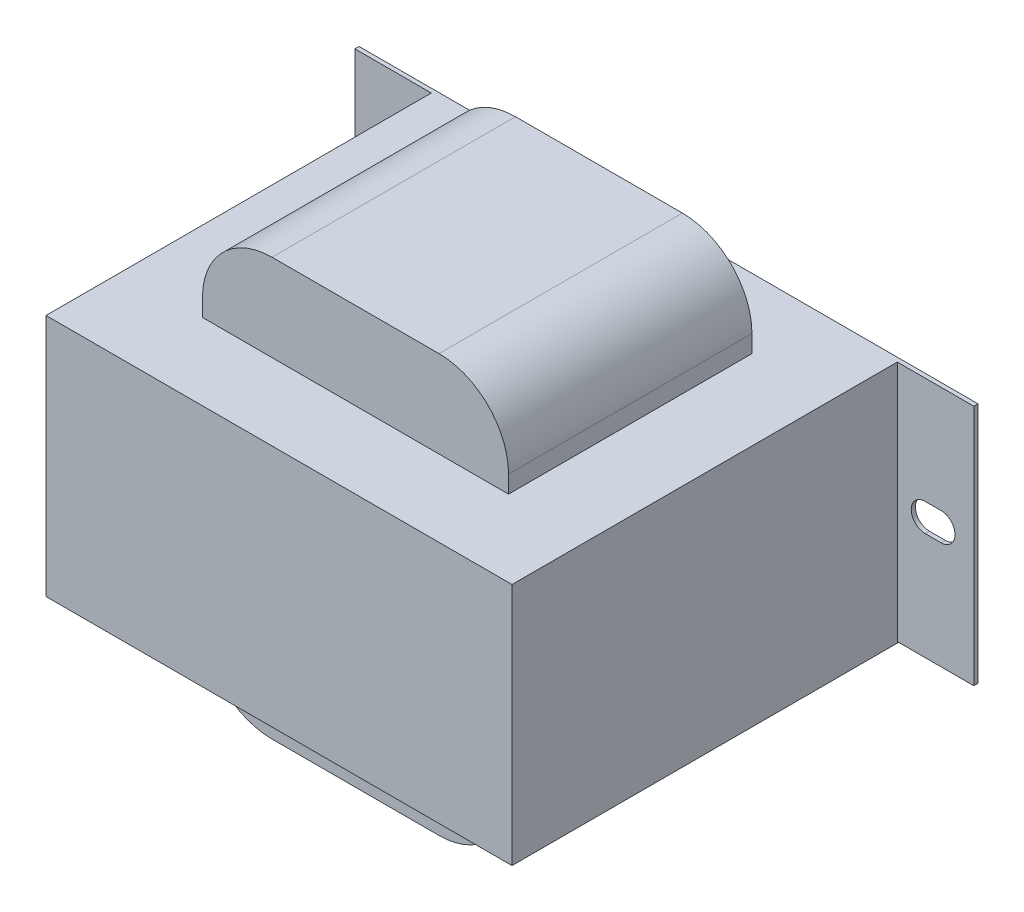
ISO-10303-21;
HEADER;
FILE_DESCRIPTION(('STEP AP214'),'2;1');
FILE_NAME('part.step','',(''),(''),'','','');
FILE_SCHEMA(('AUTOMOTIVE_DESIGN { 1 0 10303 214 1 1 1 1 }'));
ENDSEC;
DATA;
#1=APPLICATION_CONTEXT('core data for automotive mechanical design processes');
#2=APPLICATION_PROTOCOL_DEFINITION('international standard','automotive_design',2000,#1);
#3=PRODUCT_CONTEXT('',#1,'mechanical');
#4=PRODUCT('Part','Part','',(#3));
#5=PRODUCT_RELATED_PRODUCT_CATEGORY('part','',(#4));
#6=PRODUCT_DEFINITION_FORMATION('','',#4);
#7=PRODUCT_DEFINITION_CONTEXT('part definition',#1,'design');
#8=PRODUCT_DEFINITION('design','',#6,#7);
#9=PRODUCT_DEFINITION_SHAPE('','',#8);
#10=(LENGTH_UNIT() NAMED_UNIT(*) SI_UNIT(.MILLI.,.METRE.));
#11=(NAMED_UNIT(*) PLANE_ANGLE_UNIT() SI_UNIT($,.RADIAN.));
#12=(NAMED_UNIT(*) SI_UNIT($,.STERADIAN.) SOLID_ANGLE_UNIT());
#13=UNCERTAINTY_MEASURE_WITH_UNIT(LENGTH_MEASURE(1.E-05),#10,'distance_accuracy_value','');
#14=(GEOMETRIC_REPRESENTATION_CONTEXT(3) GLOBAL_UNCERTAINTY_ASSIGNED_CONTEXT((#13)) GLOBAL_UNIT_ASSIGNED_CONTEXT((#10,
#11,#12)) REPRESENTATION_CONTEXT('',''));
#15=CARTESIAN_POINT('',(0.,0.,0.));
#16=DIRECTION('',(0.,0.,1.));
#17=DIRECTION('',(1.,0.,0.));
#18=AXIS2_PLACEMENT_3D('',#15,#16,#17);
#19=CARTESIAN_POINT('',(33.5,17.5,56.));
#20=DIRECTION('',(-1.,0.,0.));
#21=DIRECTION('',(0.,0.,1.));
#22=AXIS2_PLACEMENT_3D('',#19,#20,#21);
#23=PLANE('',#22);
#24=DIRECTION('',(0.,0.,-1.));
#25=VECTOR('',#24,1.);
#26=CARTESIAN_POINT('',(33.5,-17.3083227098887,0.6));
#27=LINE('',#26,#25);
#28=CARTESIAN_POINT('',(33.5,-17.3083227098887,0.6));
#29=VERTEX_POINT('',#28);
#30=CARTESIAN_POINT('',(33.5,-17.3083227098887,0.));
#31=VERTEX_POINT('',#30);
#32=EDGE_CURVE('E356',#29,#31,#27,.T.);
#33=ORIENTED_EDGE('',*,*,#32,.F.);
#34=DIRECTION('',(0.,1.,0.));
#35=VECTOR('',#34,1.);
#36=CARTESIAN_POINT('',(33.5,17.5,0.6));
#37=LINE('',#36,#35);
#38=CARTESIAN_POINT('',(33.5,17.5,0.600000000000003));
#39=VERTEX_POINT('',#38);
#40=EDGE_CURVE('E337',#29,#39,#37,.T.);
#41=ORIENTED_EDGE('',*,*,#40,.T.);
#42=DIRECTION('',(0.,0.,-1.));
#43=VECTOR('',#42,1.);
#44=CARTESIAN_POINT('',(33.5,17.5,56.));
#45=LINE('',#44,#43);
#46=CARTESIAN_POINT('',(33.5,17.5,56.));
#47=VERTEX_POINT('',#46);
#48=EDGE_CURVE('E314',#47,#39,#45,.T.);
#49=ORIENTED_EDGE('',*,*,#48,.F.);
#50=DIRECTION('',(0.,1.,0.));
#51=VECTOR('',#50,1.);
#52=CARTESIAN_POINT('',(33.5,17.5,56.));
#53=LINE('',#52,#51);
#54=CARTESIAN_POINT('',(33.5,-17.5,56.));
#55=VERTEX_POINT('',#54);
#56=EDGE_CURVE('E320',#55,#47,#53,.T.);
#57=ORIENTED_EDGE('',*,*,#56,.F.);
#58=DIRECTION('',(0.,0.,-1.));
#59=VECTOR('',#58,1.);
#60=CARTESIAN_POINT('',(33.5,-17.5,56.));
#61=LINE('',#60,#59);
#62=CARTESIAN_POINT('',(33.5,-17.5,0.));
#63=VERTEX_POINT('',#62);
#64=EDGE_CURVE('E318',#55,#63,#61,.T.);
#65=ORIENTED_EDGE('',*,*,#64,.T.);
#66=DIRECTION('',(0.,1.,0.));
#67=VECTOR('',#66,1.);
#68=CARTESIAN_POINT('',(33.5,17.5,0.));
#69=LINE('',#68,#67);
#70=EDGE_CURVE('E335',#63,#31,#69,.T.);
#71=ORIENTED_EDGE('',*,*,#70,.T.);
#72=EDGE_LOOP('',(#33,#41,#49,#57,#65,#71));
#73=FACE_BOUND('',#72,.T.);
#74=ADVANCED_FACE('F28',(#73),#23,.F.);
#75=CARTESIAN_POINT('',(-33.5,-17.5,56.));
#76=DIRECTION('',(0.,1.,0.));
#77=DIRECTION('',(-1.,0.,0.));
#78=AXIS2_PLACEMENT_3D('',#75,#76,#77);
#79=PLANE('',#78);
#80=DIRECTION('',(1.,0.,0.));
#81=VECTOR('',#80,1.);
#82=CARTESIAN_POINT('',(-33.5,-17.5,0.));
#83=LINE('',#82,#81);
#84=CARTESIAN_POINT('',(-33.5,-17.5,0.));
#85=VERTEX_POINT('',#84);
#86=EDGE_CURVE('E439',#85,#63,#83,.T.);
#87=ORIENTED_EDGE('',*,*,#86,.T.);
#88=ORIENTED_EDGE('',*,*,#64,.F.);
#89=DIRECTION('',(1.,0.,0.));
#90=VECTOR('',#89,1.);
#91=CARTESIAN_POINT('',(-33.5,-17.5,56.));
#92=LINE('',#91,#90);
#93=CARTESIAN_POINT('',(-33.5,-17.5,56.));
#94=VERTEX_POINT('',#93);
#95=EDGE_CURVE('E445',#94,#55,#92,.T.);
#96=ORIENTED_EDGE('',*,*,#95,.F.);
#97=DIRECTION('',(0.,0.,-1.));
#98=VECTOR('',#97,1.);
#99=CARTESIAN_POINT('',(-33.5,-17.5,56.));
#100=LINE('',#99,#98);
#101=EDGE_CURVE('E523',#94,#85,#100,.T.);
#102=ORIENTED_EDGE('',*,*,#101,.T.);
#103=EDGE_LOOP('',(#87,#88,#96,#102));
#104=FACE_BOUND('',#103,.T.);
#105=DIRECTION('',(1.,0.,0.));
#106=VECTOR('',#105,1.);
#107=CARTESIAN_POINT('',(-33.5,-17.5,9.99999999999999));
#108=LINE('',#107,#106);
#109=CARTESIAN_POINT('',(-22.,-17.5,9.99999999999999));
#110=VERTEX_POINT('',#109);
#111=CARTESIAN_POINT('',(22.,-17.5,9.99999999999999));
#112=VERTEX_POINT('',#111);
#113=EDGE_CURVE('E430',#110,#112,#108,.T.);
#114=ORIENTED_EDGE('',*,*,#113,.F.);
#115=DIRECTION('',(0.,0.,1.));
#116=VECTOR('',#115,1.);
#117=CARTESIAN_POINT('',(-22.,-17.5,56.));
#118=LINE('',#117,#116);
#119=CARTESIAN_POINT('',(-22.,-17.5,45.));
#120=VERTEX_POINT('',#119);
#121=EDGE_CURVE('E432',#110,#120,#118,.T.);
#122=ORIENTED_EDGE('',*,*,#121,.T.);
#123=DIRECTION('',(1.,0.,0.));
#124=VECTOR('',#123,1.);
#125=CARTESIAN_POINT('',(-33.5,-17.5,45.));
#126=LINE('',#125,#124);
#127=CARTESIAN_POINT('',(22.,-17.5,45.));
#128=VERTEX_POINT('',#127);
#129=EDGE_CURVE('E412',#120,#128,#126,.T.);
#130=ORIENTED_EDGE('',*,*,#129,.T.);
#131=DIRECTION('',(0.,0.,-1.));
#132=VECTOR('',#131,1.);
#133=CARTESIAN_POINT('',(22.,-17.5,56.));
#134=LINE('',#133,#132);
#135=EDGE_CURVE('E435',#128,#112,#134,.T.);
#136=ORIENTED_EDGE('',*,*,#135,.T.);
#137=EDGE_LOOP('',(#114,#122,#130,#136));
#138=FACE_BOUND('',#137,.T.);
#139=ADVANCED_FACE('F524',(#104,#138),#79,.F.);
#140=CARTESIAN_POINT('',(-33.5,17.5,56.));
#141=DIRECTION('',(0.,-1.,0.));
#142=DIRECTION('',(0.,0.,-1.));
#143=AXIS2_PLACEMENT_3D('',#140,#141,#142);
#144=PLANE('',#143);
#145=DIRECTION('',(-1.,0.,0.));
#146=VECTOR('',#145,1.);
#147=CARTESIAN_POINT('',(-33.5,17.5,0.));
#148=LINE('',#147,#146);
#149=CARTESIAN_POINT('',(44.5,17.5,0.));
#150=VERTEX_POINT('',#149);
#151=CARTESIAN_POINT('',(-44.5,17.5,0.));
#152=VERTEX_POINT('',#151);
#153=EDGE_CURVE('E442',#150,#152,#148,.T.);
#154=ORIENTED_EDGE('',*,*,#153,.T.);
#155=DIRECTION('',(0.,0.,-1.));
#156=VECTOR('',#155,1.);
#157=CARTESIAN_POINT('',(-44.5,17.5,0.6));
#158=LINE('',#157,#156);
#159=CARTESIAN_POINT('',(-44.5,17.5,0.6));
#160=VERTEX_POINT('',#159);
#161=EDGE_CURVE('E280',#160,#152,#158,.T.);
#162=ORIENTED_EDGE('',*,*,#161,.F.);
#163=DIRECTION('',(1.,0.,0.));
#164=VECTOR('',#163,1.);
#165=CARTESIAN_POINT('',(-33.5,17.5,0.6));
#166=LINE('',#165,#164);
#167=CARTESIAN_POINT('',(-33.5,17.5,0.6));
#168=VERTEX_POINT('',#167);
#169=EDGE_CURVE('E279',#160,#168,#166,.T.);
#170=ORIENTED_EDGE('',*,*,#169,.T.);
#171=DIRECTION('',(0.,0.,-1.));
#172=VECTOR('',#171,1.);
#173=CARTESIAN_POINT('',(-33.5,17.5,56.));
#174=LINE('',#173,#172);
#175=CARTESIAN_POINT('',(-33.5,17.5,56.));
#176=VERTEX_POINT('',#175);
#177=EDGE_CURVE('E306',#176,#168,#174,.T.);
#178=ORIENTED_EDGE('',*,*,#177,.F.);
#179=DIRECTION('',(-1.,0.,0.));
#180=VECTOR('',#179,1.);
#181=CARTESIAN_POINT('',(-33.5,17.5,56.));
#182=LINE('',#181,#180);
#183=EDGE_CURVE('E315',#47,#176,#182,.T.);
#184=ORIENTED_EDGE('',*,*,#183,.F.);
#185=ORIENTED_EDGE('',*,*,#48,.T.);
#186=DIRECTION('',(1.,0.,0.));
#187=VECTOR('',#186,1.);
#188=CARTESIAN_POINT('',(33.5,17.5,0.6));
#189=LINE('',#188,#187);
#190=CARTESIAN_POINT('',(44.5,17.5,0.6));
#191=VERTEX_POINT('',#190);
#192=EDGE_CURVE('E53',#39,#191,#189,.T.);
#193=ORIENTED_EDGE('',*,*,#192,.T.);
#194=DIRECTION('',(0.,0.,-1.));
#195=VECTOR('',#194,1.);
#196=CARTESIAN_POINT('',(44.5,17.5,0.6));
#197=LINE('',#196,#195);
#198=EDGE_CURVE('E353',#191,#150,#197,.T.);
#199=ORIENTED_EDGE('',*,*,#198,.T.);
#200=EDGE_LOOP('',(#154,#162,#170,#178,#184,#185,#193,#199));
#201=FACE_BOUND('',#200,.T.);
#202=DIRECTION('',(-1.,0.,0.));
#203=VECTOR('',#202,1.);
#204=CARTESIAN_POINT('',(-33.5,17.5,9.99999999999999));
#205=LINE('',#204,#203);
#206=CARTESIAN_POINT('',(22.,17.5,9.99999999999999));
#207=VERTEX_POINT('',#206);
#208=CARTESIAN_POINT('',(-22.,17.5,9.99999999999999));
#209=VERTEX_POINT('',#208);
#210=EDGE_CURVE('E11',#207,#209,#205,.T.);
#211=ORIENTED_EDGE('',*,*,#210,.F.);
#212=DIRECTION('',(0.,0.,1.));
#213=VECTOR('',#212,1.);
#214=CARTESIAN_POINT('',(22.,17.5,56.));
#215=LINE('',#214,#213);
#216=CARTESIAN_POINT('',(22.,17.5,45.));
#217=VERTEX_POINT('',#216);
#218=EDGE_CURVE('E37',#207,#217,#215,.T.);
#219=ORIENTED_EDGE('',*,*,#218,.T.);
#220=DIRECTION('',(-1.,0.,0.));
#221=VECTOR('',#220,1.);
#222=CARTESIAN_POINT('',(-33.5,17.5,45.));
#223=LINE('',#222,#221);
#224=CARTESIAN_POINT('',(-22.,17.5,45.));
#225=VERTEX_POINT('',#224);
#226=EDGE_CURVE('E526',#217,#225,#223,.T.);
#227=ORIENTED_EDGE('',*,*,#226,.T.);
#228=DIRECTION('',(0.,0.,-1.));
#229=VECTOR('',#228,1.);
#230=CARTESIAN_POINT('',(-22.,17.5,56.));
#231=LINE('',#230,#229);
#232=EDGE_CURVE('E528',#225,#209,#231,.T.);
#233=ORIENTED_EDGE('',*,*,#232,.T.);
#234=EDGE_LOOP('',(#211,#219,#227,#233));
#235=FACE_BOUND('',#234,.T.);
#236=ADVANCED_FACE('F303',(#201,#235),#144,.F.);
#237=CARTESIAN_POINT('',(-33.5,17.5,56.));
#238=DIRECTION('',(1.,0.,0.));
#239=DIRECTION('',(0.,1.,0.));
#240=AXIS2_PLACEMENT_3D('',#237,#238,#239);
#241=PLANE('',#240);
#242=ORIENTED_EDGE('',*,*,#177,.T.);
#243=DIRECTION('',(0.,-1.,0.));
#244=VECTOR('',#243,1.);
#245=CARTESIAN_POINT('',(-33.5,17.5,0.6));
#246=LINE('',#245,#244);
#247=CARTESIAN_POINT('',(-33.5,-17.3083227098887,0.6));
#248=VERTEX_POINT('',#247);
#249=EDGE_CURVE('E272',#168,#248,#246,.T.);
#250=ORIENTED_EDGE('',*,*,#249,.T.);
#251=DIRECTION('',(0.,0.,-1.));
#252=VECTOR('',#251,1.);
#253=CARTESIAN_POINT('',(-33.5,-17.3083227098887,0.6));
#254=LINE('',#253,#252);
#255=CARTESIAN_POINT('',(-33.5,-17.3083227098887,0.));
#256=VERTEX_POINT('',#255);
#257=EDGE_CURVE('E286',#248,#256,#254,.T.);
#258=ORIENTED_EDGE('',*,*,#257,.T.);
#259=DIRECTION('',(0.,-1.,0.));
#260=VECTOR('',#259,1.);
#261=CARTESIAN_POINT('',(-33.5,17.5,0.));
#262=LINE('',#261,#260);
#263=EDGE_CURVE('E324',#256,#85,#262,.T.);
#264=ORIENTED_EDGE('',*,*,#263,.T.);
#265=ORIENTED_EDGE('',*,*,#101,.F.);
#266=DIRECTION('',(0.,-1.,0.));
#267=VECTOR('',#266,1.);
#268=CARTESIAN_POINT('',(-33.5,17.5,56.));
#269=LINE('',#268,#267);
#270=EDGE_CURVE('E313',#176,#94,#269,.T.);
#271=ORIENTED_EDGE('',*,*,#270,.F.);
#272=EDGE_LOOP('',(#242,#250,#258,#264,#265,#271));
#273=FACE_BOUND('',#272,.T.);
#274=ADVANCED_FACE('F30',(#273),#241,.F.);
#275=CARTESIAN_POINT('',(-33.5,-17.5,56.));
#276=DIRECTION('',(0.,0.,1.));
#277=DIRECTION('',(1.,0.,0.));
#278=AXIS2_PLACEMENT_3D('',#275,#276,#277);
#279=PLANE('',#278);
#280=ORIENTED_EDGE('',*,*,#270,.T.);
#281=ORIENTED_EDGE('',*,*,#95,.T.);
#282=ORIENTED_EDGE('',*,*,#56,.T.);
#283=ORIENTED_EDGE('',*,*,#183,.T.);
#284=EDGE_LOOP('',(#280,#281,#282,#283));
#285=FACE_BOUND('',#284,.T.);
#286=ADVANCED_FACE('F449',(#285),#279,.T.);
#287=CARTESIAN_POINT('',(-33.5,-17.5,0.));
#288=DIRECTION('',(0.,0.,1.));
#289=DIRECTION('',(1.,0.,0.));
#290=AXIS2_PLACEMENT_3D('',#287,#288,#289);
#291=PLANE('',#290);
#292=ORIENTED_EDGE('',*,*,#263,.F.);
#293=DIRECTION('',(-1.,0.,0.));
#294=VECTOR('',#293,1.);
#295=CARTESIAN_POINT('',(-33.5,-17.3083227098887,0.));
#296=LINE('',#295,#294);
#297=CARTESIAN_POINT('',(-44.5,-17.3083227098887,0.));
#298=VERTEX_POINT('',#297);
#299=EDGE_CURVE('E45',#256,#298,#296,.T.);
#300=ORIENTED_EDGE('',*,*,#299,.T.);
#301=DIRECTION('',(0.,1.,0.));
#302=VECTOR('',#301,1.);
#303=CARTESIAN_POINT('',(-44.5,17.5,0.));
#304=LINE('',#303,#302);
#305=EDGE_CURVE('E269',#298,#152,#304,.T.);
#306=ORIENTED_EDGE('',*,*,#305,.T.);
#307=ORIENTED_EDGE('',*,*,#153,.F.);
#308=DIRECTION('',(0.,-1.,0.));
#309=VECTOR('',#308,1.);
#310=CARTESIAN_POINT('',(44.5,17.5,0.));
#311=LINE('',#310,#309);
#312=CARTESIAN_POINT('',(44.5,-17.3083227098887,0.));
#313=VERTEX_POINT('',#312);
#314=EDGE_CURVE('E345',#150,#313,#311,.T.);
#315=ORIENTED_EDGE('',*,*,#314,.T.);
#316=DIRECTION('',(-1.,0.,0.));
#317=VECTOR('',#316,1.);
#318=CARTESIAN_POINT('',(33.5,-17.3083227098887,0.));
#319=LINE('',#318,#317);
#320=EDGE_CURVE('E340',#313,#31,#319,.T.);
#321=ORIENTED_EDGE('',*,*,#320,.T.);
#322=ORIENTED_EDGE('',*,*,#70,.F.);
#323=ORIENTED_EDGE('',*,*,#86,.F.);
#324=EDGE_LOOP('',(#292,#300,#306,#307,#315,#321,#322,#323));
#325=FACE_BOUND('',#324,.T.);
#326=DIRECTION('',(-1.,0.,0.));
#327=VECTOR('',#326,1.);
#328=CARTESIAN_POINT('',(37.5,-1.85275400788431,0.));
#329=LINE('',#328,#327);
#330=CARTESIAN_POINT('',(39.8,-1.85275400788431,0.));
#331=VERTEX_POINT('',#330);
#332=CARTESIAN_POINT('',(37.5,-1.85275400788431,0.));
#333=VERTEX_POINT('',#332);
#334=EDGE_CURVE('E496',#331,#333,#329,.T.);
#335=ORIENTED_EDGE('',*,*,#334,.F.);
#336=CARTESIAN_POINT('',(39.8,0.147245992115691,0.));
#337=DIRECTION('',(0.,0.,-1.));
#338=DIRECTION('',(-1.,0.,0.));
#339=AXIS2_PLACEMENT_3D('',#336,#337,#338);
#340=CIRCLE('',#339,2.);
#341=CARTESIAN_POINT('',(39.8,2.14724599211569,0.));
#342=VERTEX_POINT('',#341);
#343=EDGE_CURVE('E283',#342,#331,#340,.T.);
#344=ORIENTED_EDGE('',*,*,#343,.F.);
#345=DIRECTION('',(1.,0.,0.));
#346=VECTOR('',#345,1.);
#347=CARTESIAN_POINT('',(39.8,2.14724599211569,0.));
#348=LINE('',#347,#346);
#349=CARTESIAN_POINT('',(37.5,2.14724599211569,0.));
#350=VERTEX_POINT('',#349);
#351=EDGE_CURVE('E492',#350,#342,#348,.T.);
#352=ORIENTED_EDGE('',*,*,#351,.F.);
#353=CARTESIAN_POINT('',(37.5,0.147245992115691,0.));
#354=DIRECTION('',(0.,0.,-1.));
#355=DIRECTION('',(-1.,0.,0.));
#356=AXIS2_PLACEMENT_3D('',#353,#354,#355);
#357=CIRCLE('',#356,2.);
#358=EDGE_CURVE('E494',#333,#350,#357,.T.);
#359=ORIENTED_EDGE('',*,*,#358,.F.);
#360=EDGE_LOOP('',(#335,#344,#352,#359));
#361=FACE_BOUND('',#360,.T.);
#362=CARTESIAN_POINT('',(-37.5,0.147245992115691,0.));
#363=DIRECTION('',(0.,0.,-1.));
#364=DIRECTION('',(1.,0.,0.));
#365=AXIS2_PLACEMENT_3D('',#362,#363,#364);
#366=CIRCLE('',#365,2.);
#367=CARTESIAN_POINT('',(-37.5,2.14724599211569,0.));
#368=VERTEX_POINT('',#367);
#369=CARTESIAN_POINT('',(-37.5,-1.85275400788431,0.));
#370=VERTEX_POINT('',#369);
#371=EDGE_CURVE('E247',#368,#370,#366,.T.);
#372=ORIENTED_EDGE('',*,*,#371,.F.);
#373=DIRECTION('',(1.,0.,0.));
#374=VECTOR('',#373,1.);
#375=CARTESIAN_POINT('',(-39.8,2.14724599211569,0.));
#376=LINE('',#375,#374);
#377=CARTESIAN_POINT('',(-39.8,2.14724599211569,0.));
#378=VERTEX_POINT('',#377);
#379=EDGE_CURVE('E251',#378,#368,#376,.T.);
#380=ORIENTED_EDGE('',*,*,#379,.F.);
#381=CARTESIAN_POINT('',(-39.8,0.147245992115691,0.));
#382=DIRECTION('',(0.,0.,-1.));
#383=DIRECTION('',(1.,0.,0.));
#384=AXIS2_PLACEMENT_3D('',#381,#382,#383);
#385=CIRCLE('',#384,2.);
#386=CARTESIAN_POINT('',(-39.8,-1.85275400788431,0.));
#387=VERTEX_POINT('',#386);
#388=EDGE_CURVE('E231',#387,#378,#385,.T.);
#389=ORIENTED_EDGE('',*,*,#388,.F.);
#390=DIRECTION('',(-1.,0.,0.));
#391=VECTOR('',#390,1.);
#392=CARTESIAN_POINT('',(-37.5,-1.85275400788431,0.));
#393=LINE('',#392,#391);
#394=EDGE_CURVE('E243',#370,#387,#393,.T.);
#395=ORIENTED_EDGE('',*,*,#394,.F.);
#396=EDGE_LOOP('',(#372,#380,#389,#395));
#397=FACE_BOUND('',#396,.T.);
#398=ADVANCED_FACE('F249',(#325,#361,#397),#291,.F.);
#399=CARTESIAN_POINT('',(-12.,20.,9.99999999999999));
#400=DIRECTION('',(0.,0.,1.));
#401=DIRECTION('',(1.,0.,0.));
#402=AXIS2_PLACEMENT_3D('',#399,#400,#401);
#403=CYLINDRICAL_SURFACE('',#402,9.99999999999999);
#404=CARTESIAN_POINT('',(-12.,20.,45.));
#405=DIRECTION('',(0.,0.,1.));
#406=DIRECTION('',(1.,0.,0.));
#407=AXIS2_PLACEMENT_3D('',#404,#405,#406);
#408=CIRCLE('',#407,9.99999999999999);
#409=CARTESIAN_POINT('',(-12.,30.,45.));
#410=VERTEX_POINT('',#409);
#411=CARTESIAN_POINT('',(-22.,20.,45.));
#412=VERTEX_POINT('',#411);
#413=EDGE_CURVE('E359',#410,#412,#408,.T.);
#414=ORIENTED_EDGE('',*,*,#413,.F.);
#415=DIRECTION('',(0.,0.,1.));
#416=VECTOR('',#415,1.);
#417=CARTESIAN_POINT('',(-12.,30.,9.99999999999999));
#418=LINE('',#417,#416);
#419=CARTESIAN_POINT('',(-12.,30.,9.99999999999999));
#420=VERTEX_POINT('',#419);
#421=EDGE_CURVE('E410',#420,#410,#418,.T.);
#422=ORIENTED_EDGE('',*,*,#421,.F.);
#423=CARTESIAN_POINT('',(-12.,20.,9.99999999999999));
#424=DIRECTION('',(0.,0.,1.));
#425=DIRECTION('',(1.,0.,0.));
#426=AXIS2_PLACEMENT_3D('',#423,#424,#425);
#427=CIRCLE('',#426,9.99999999999999);
#428=CARTESIAN_POINT('',(-22.,20.,9.99999999999999));
#429=VERTEX_POINT('',#428);
#430=EDGE_CURVE('E383',#420,#429,#427,.T.);
#431=ORIENTED_EDGE('',*,*,#430,.T.);
#432=DIRECTION('',(0.,0.,1.));
#433=VECTOR('',#432,1.);
#434=CARTESIAN_POINT('',(-22.,20.,9.99999999999999));
#435=LINE('',#434,#433);
#436=EDGE_CURVE('E409',#429,#412,#435,.T.);
#437=ORIENTED_EDGE('',*,*,#436,.T.);
#438=EDGE_LOOP('',(#414,#422,#431,#437));
#439=FACE_BOUND('',#438,.T.);
#440=ADVANCED_FACE('F556',(#439),#403,.T.);
#441=CARTESIAN_POINT('',(-12.,30.,9.99999999999999));
#442=DIRECTION('',(0.,1.,0.));
#443=DIRECTION('',(0.,0.,1.));
#444=AXIS2_PLACEMENT_3D('',#441,#442,#443);
#445=PLANE('',#444);
#446=DIRECTION('',(-1.,0.,0.));
#447=VECTOR('',#446,1.);
#448=CARTESIAN_POINT('',(-12.,30.,45.));
#449=LINE('',#448,#447);
#450=CARTESIAN_POINT('',(12.,30.,45.));
#451=VERTEX_POINT('',#450);
#452=EDGE_CURVE('E380',#451,#410,#449,.T.);
#453=ORIENTED_EDGE('',*,*,#452,.F.);
#454=DIRECTION('',(0.,0.,1.));
#455=VECTOR('',#454,1.);
#456=CARTESIAN_POINT('',(12.,30.,9.99999999999999));
#457=LINE('',#456,#455);
#458=CARTESIAN_POINT('',(12.,30.,9.99999999999999));
#459=VERTEX_POINT('',#458);
#460=EDGE_CURVE('E413',#459,#451,#457,.T.);
#461=ORIENTED_EDGE('',*,*,#460,.F.);
#462=DIRECTION('',(-1.,0.,0.));
#463=VECTOR('',#462,1.);
#464=CARTESIAN_POINT('',(-12.,30.,9.99999999999999));
#465=LINE('',#464,#463);
#466=EDGE_CURVE('E406',#459,#420,#465,.T.);
#467=ORIENTED_EDGE('',*,*,#466,.T.);
#468=ORIENTED_EDGE('',*,*,#421,.T.);
#469=EDGE_LOOP('',(#453,#461,#467,#468));
#470=FACE_BOUND('',#469,.T.);
#471=ADVANCED_FACE('F553',(#470),#445,.T.);
#472=CARTESIAN_POINT('',(12.,20.,9.99999999999999));
#473=DIRECTION('',(0.,0.,1.));
#474=DIRECTION('',(1.,0.,0.));
#475=AXIS2_PLACEMENT_3D('',#472,#473,#474);
#476=CYLINDRICAL_SURFACE('',#475,9.99999999999999);
#477=CARTESIAN_POINT('',(12.,20.,45.));
#478=DIRECTION('',(0.,0.,1.));
#479=DIRECTION('',(-1.,0.,0.));
#480=AXIS2_PLACEMENT_3D('',#477,#478,#479);
#481=CIRCLE('',#480,9.99999999999999);
#482=CARTESIAN_POINT('',(22.,20.,45.));
#483=VERTEX_POINT('',#482);
#484=EDGE_CURVE('E377',#483,#451,#481,.T.);
#485=ORIENTED_EDGE('',*,*,#484,.F.);
#486=DIRECTION('',(0.,0.,1.));
#487=VECTOR('',#486,1.);
#488=CARTESIAN_POINT('',(22.,20.,9.99999999999999));
#489=LINE('',#488,#487);
#490=CARTESIAN_POINT('',(22.,20.,9.99999999999999));
#491=VERTEX_POINT('',#490);
#492=EDGE_CURVE('E415',#491,#483,#489,.T.);
#493=ORIENTED_EDGE('',*,*,#492,.F.);
#494=CARTESIAN_POINT('',(12.,20.,9.99999999999999));
#495=DIRECTION('',(0.,0.,1.));
#496=DIRECTION('',(-1.,0.,0.));
#497=AXIS2_PLACEMENT_3D('',#494,#495,#496);
#498=CIRCLE('',#497,9.99999999999999);
#499=EDGE_CURVE('E403',#491,#459,#498,.T.);
#500=ORIENTED_EDGE('',*,*,#499,.T.);
#501=ORIENTED_EDGE('',*,*,#460,.T.);
#502=EDGE_LOOP('',(#485,#493,#500,#501));
#503=FACE_BOUND('',#502,.T.);
#504=ADVANCED_FACE('F548',(#503),#476,.T.);
#505=CARTESIAN_POINT('',(-12.,20.,9.99999999999999));
#506=DIRECTION('',(0.,0.,1.));
#507=DIRECTION('',(1.,0.,0.));
#508=AXIS2_PLACEMENT_3D('',#505,#506,#507);
#509=PLANE('',#508);
#510=DIRECTION('',(0.,1.,0.));
#511=VECTOR('',#510,1.);
#512=CARTESIAN_POINT('',(22.,20.,9.99999999999999));
#513=LINE('',#512,#511);
#514=EDGE_CURVE('E399',#207,#491,#513,.T.);
#515=ORIENTED_EDGE('',*,*,#514,.F.);
#516=ORIENTED_EDGE('',*,*,#210,.T.);
#517=DIRECTION('',(0.,-1.,0.));
#518=VECTOR('',#517,1.);
#519=CARTESIAN_POINT('',(-22.,20.,9.99999999999999));
#520=LINE('',#519,#518);
#521=EDGE_CURVE('E387',#429,#209,#520,.T.);
#522=ORIENTED_EDGE('',*,*,#521,.F.);
#523=ORIENTED_EDGE('',*,*,#430,.F.);
#524=ORIENTED_EDGE('',*,*,#466,.F.);
#525=ORIENTED_EDGE('',*,*,#499,.F.);
#526=EDGE_LOOP('',(#515,#516,#522,#523,#524,#525));
#527=FACE_BOUND('',#526,.T.);
#528=ADVANCED_FACE('F542',(#527),#509,.F.);
#529=CARTESIAN_POINT('',(-12.,20.,45.));
#530=DIRECTION('',(0.,0.,1.));
#531=DIRECTION('',(1.,0.,0.));
#532=AXIS2_PLACEMENT_3D('',#529,#530,#531);
#533=PLANE('',#532);
#534=ORIENTED_EDGE('',*,*,#226,.F.);
#535=DIRECTION('',(0.,1.,0.));
#536=VECTOR('',#535,1.);
#537=CARTESIAN_POINT('',(22.,20.,45.));
#538=LINE('',#537,#536);
#539=EDGE_CURVE('E374',#217,#483,#538,.T.);
#540=ORIENTED_EDGE('',*,*,#539,.T.);
#541=ORIENTED_EDGE('',*,*,#484,.T.);
#542=ORIENTED_EDGE('',*,*,#452,.T.);
#543=ORIENTED_EDGE('',*,*,#413,.T.);
#544=DIRECTION('',(0.,-1.,0.));
#545=VECTOR('',#544,1.);
#546=CARTESIAN_POINT('',(-22.,20.,45.));
#547=LINE('',#546,#545);
#548=EDGE_CURVE('E363',#412,#225,#547,.T.);
#549=ORIENTED_EDGE('',*,*,#548,.T.);
#550=EDGE_LOOP('',(#534,#540,#541,#542,#543,#549));
#551=FACE_BOUND('',#550,.T.);
#552=ADVANCED_FACE('F551',(#551),#533,.T.);
#553=CARTESIAN_POINT('',(-22.,20.,9.99999999999999));
#554=DIRECTION('',(-1.,0.,0.));
#555=DIRECTION('',(0.,0.,1.));
#556=AXIS2_PLACEMENT_3D('',#553,#554,#555);
#557=PLANE('',#556);
#558=ORIENTED_EDGE('',*,*,#232,.F.);
#559=ORIENTED_EDGE('',*,*,#548,.F.);
#560=ORIENTED_EDGE('',*,*,#436,.F.);
#561=ORIENTED_EDGE('',*,*,#521,.T.);
#562=EDGE_LOOP('',(#558,#559,#560,#561));
#563=FACE_BOUND('',#562,.T.);
#564=ADVANCED_FACE('F560',(#563),#557,.T.);
#565=CARTESIAN_POINT('',(22.,20.,9.99999999999999));
#566=DIRECTION('',(1.,0.,0.));
#567=DIRECTION('',(0.,1.,0.));
#568=AXIS2_PLACEMENT_3D('',#565,#566,#567);
#569=PLANE('',#568);
#570=ORIENTED_EDGE('',*,*,#218,.F.);
#571=ORIENTED_EDGE('',*,*,#514,.T.);
#572=ORIENTED_EDGE('',*,*,#492,.T.);
#573=ORIENTED_EDGE('',*,*,#539,.F.);
#574=EDGE_LOOP('',(#570,#571,#572,#573));
#575=FACE_BOUND('',#574,.T.);
#576=ADVANCED_FACE('F538',(#575),#569,.T.);
#577=ORIENTED_EDGE('',*,*,#135,.F.);
#578=CARTESIAN_POINT('',(22.,-19.9999999999999,45.));
#579=VERTEX_POINT('',#578);
#580=EDGE_CURVE('E375',#579,#128,#538,.T.);
#581=ORIENTED_EDGE('',*,*,#580,.F.);
#582=DIRECTION('',(0.,0.,1.));
#583=VECTOR('',#582,1.);
#584=CARTESIAN_POINT('',(22.,-19.9999999999999,9.99999999999999));
#585=LINE('',#584,#583);
#586=CARTESIAN_POINT('',(22.,-19.9999999999999,9.99999999999999));
#587=VERTEX_POINT('',#586);
#588=EDGE_CURVE('E418',#587,#579,#585,.T.);
#589=ORIENTED_EDGE('',*,*,#588,.F.);
#590=EDGE_CURVE('E400',#587,#112,#513,.T.);
#591=ORIENTED_EDGE('',*,*,#590,.T.);
#592=EDGE_LOOP('',(#577,#581,#589,#591));
#593=FACE_BOUND('',#592,.T.);
#594=ADVANCED_FACE('F568',(#593),#569,.T.);
#595=ORIENTED_EDGE('',*,*,#121,.F.);
#596=CARTESIAN_POINT('',(-22.,-20.,9.99999999999999));
#597=VERTEX_POINT('',#596);
#598=EDGE_CURVE('E386',#110,#597,#520,.T.);
#599=ORIENTED_EDGE('',*,*,#598,.T.);
#600=DIRECTION('',(0.,0.,1.));
#601=VECTOR('',#600,1.);
#602=CARTESIAN_POINT('',(-22.,-20.,9.99999999999999));
#603=LINE('',#602,#601);
#604=CARTESIAN_POINT('',(-22.,-20.,45.));
#605=VERTEX_POINT('',#604);
#606=EDGE_CURVE('E424',#597,#605,#603,.T.);
#607=ORIENTED_EDGE('',*,*,#606,.T.);
#608=EDGE_CURVE('E362',#120,#605,#547,.T.);
#609=ORIENTED_EDGE('',*,*,#608,.F.);
#610=EDGE_LOOP('',(#595,#599,#607,#609));
#611=FACE_BOUND('',#610,.T.);
#612=ADVANCED_FACE('F563',(#611),#557,.T.);
#613=ORIENTED_EDGE('',*,*,#598,.F.);
#614=ORIENTED_EDGE('',*,*,#113,.T.);
#615=ORIENTED_EDGE('',*,*,#590,.F.);
#616=CARTESIAN_POINT('',(12.,-20.,9.99999999999999));
#617=DIRECTION('',(0.,0.,1.));
#618=DIRECTION('',(1.,0.,0.));
#619=AXIS2_PLACEMENT_3D('',#616,#617,#618);
#620=CIRCLE('',#619,10.);
#621=CARTESIAN_POINT('',(11.9999999999999,-30.,9.99999999999999));
#622=VERTEX_POINT('',#621);
#623=EDGE_CURVE('E396',#622,#587,#620,.T.);
#624=ORIENTED_EDGE('',*,*,#623,.F.);
#625=DIRECTION('',(1.,0.,0.));
#626=VECTOR('',#625,1.);
#627=CARTESIAN_POINT('',(-12.,-30.,9.99999999999999));
#628=LINE('',#627,#626);
#629=CARTESIAN_POINT('',(-12.,-30.,9.99999999999999));
#630=VERTEX_POINT('',#629);
#631=EDGE_CURVE('E393',#630,#622,#628,.T.);
#632=ORIENTED_EDGE('',*,*,#631,.F.);
#633=CARTESIAN_POINT('',(-12.,-20.,9.99999999999999));
#634=DIRECTION('',(0.,0.,1.));
#635=DIRECTION('',(1.,0.,0.));
#636=AXIS2_PLACEMENT_3D('',#633,#634,#635);
#637=CIRCLE('',#636,9.99999999999999);
#638=EDGE_CURVE('E390',#597,#630,#637,.T.);
#639=ORIENTED_EDGE('',*,*,#638,.F.);
#640=EDGE_LOOP('',(#613,#614,#615,#624,#632,#639));
#641=FACE_BOUND('',#640,.T.);
#642=ADVANCED_FACE('F575',(#641),#509,.F.);
#643=ORIENTED_EDGE('',*,*,#129,.F.);
#644=ORIENTED_EDGE('',*,*,#608,.T.);
#645=CARTESIAN_POINT('',(-12.,-20.,45.));
#646=DIRECTION('',(0.,0.,1.));
#647=DIRECTION('',(1.,0.,0.));
#648=AXIS2_PLACEMENT_3D('',#645,#646,#647);
#649=CIRCLE('',#648,9.99999999999999);
#650=CARTESIAN_POINT('',(-12.,-30.,45.));
#651=VERTEX_POINT('',#650);
#652=EDGE_CURVE('E365',#605,#651,#649,.T.);
#653=ORIENTED_EDGE('',*,*,#652,.T.);
#654=DIRECTION('',(1.,0.,0.));
#655=VECTOR('',#654,1.);
#656=CARTESIAN_POINT('',(-12.,-30.,45.));
#657=LINE('',#656,#655);
#658=CARTESIAN_POINT('',(11.9999999999999,-30.,45.));
#659=VERTEX_POINT('',#658);
#660=EDGE_CURVE('E368',#651,#659,#657,.T.);
#661=ORIENTED_EDGE('',*,*,#660,.T.);
#662=CARTESIAN_POINT('',(12.,-20.,45.));
#663=DIRECTION('',(0.,0.,1.));
#664=DIRECTION('',(1.,0.,0.));
#665=AXIS2_PLACEMENT_3D('',#662,#663,#664);
#666=CIRCLE('',#665,10.);
#667=EDGE_CURVE('E371',#659,#579,#666,.T.);
#668=ORIENTED_EDGE('',*,*,#667,.T.);
#669=ORIENTED_EDGE('',*,*,#580,.T.);
#670=EDGE_LOOP('',(#643,#644,#653,#661,#668,#669));
#671=FACE_BOUND('',#670,.T.);
#672=ADVANCED_FACE('F571',(#671),#533,.T.);
#673=CARTESIAN_POINT('',(12.,-20.,9.99999999999999));
#674=DIRECTION('',(0.,0.,1.));
#675=DIRECTION('',(1.,0.,0.));
#676=AXIS2_PLACEMENT_3D('',#673,#674,#675);
#677=CYLINDRICAL_SURFACE('',#676,10.);
#678=ORIENTED_EDGE('',*,*,#667,.F.);
#679=DIRECTION('',(0.,0.,1.));
#680=VECTOR('',#679,1.);
#681=CARTESIAN_POINT('',(11.9999999999999,-30.,9.99999999999999));
#682=LINE('',#681,#680);
#683=EDGE_CURVE('E420',#622,#659,#682,.T.);
#684=ORIENTED_EDGE('',*,*,#683,.F.);
#685=ORIENTED_EDGE('',*,*,#623,.T.);
#686=ORIENTED_EDGE('',*,*,#588,.T.);
#687=EDGE_LOOP('',(#678,#684,#685,#686));
#688=FACE_BOUND('',#687,.T.);
#689=ADVANCED_FACE('F602',(#688),#677,.T.);
#690=CARTESIAN_POINT('',(-12.,-30.,9.99999999999999));
#691=DIRECTION('',(0.,-1.,0.));
#692=DIRECTION('',(1.,0.,0.));
#693=AXIS2_PLACEMENT_3D('',#690,#691,#692);
#694=PLANE('',#693);
#695=ORIENTED_EDGE('',*,*,#660,.F.);
#696=DIRECTION('',(0.,0.,1.));
#697=VECTOR('',#696,1.);
#698=CARTESIAN_POINT('',(-12.,-30.,9.99999999999999));
#699=LINE('',#698,#697);
#700=EDGE_CURVE('E422',#630,#651,#699,.T.);
#701=ORIENTED_EDGE('',*,*,#700,.F.);
#702=ORIENTED_EDGE('',*,*,#631,.T.);
#703=ORIENTED_EDGE('',*,*,#683,.T.);
#704=EDGE_LOOP('',(#695,#701,#702,#703));
#705=FACE_BOUND('',#704,.T.);
#706=ADVANCED_FACE('F605',(#705),#694,.T.);
#707=CARTESIAN_POINT('',(-12.,-20.,9.99999999999999));
#708=DIRECTION('',(0.,0.,1.));
#709=DIRECTION('',(1.,0.,0.));
#710=AXIS2_PLACEMENT_3D('',#707,#708,#709);
#711=CYLINDRICAL_SURFACE('',#710,9.99999999999999);
#712=ORIENTED_EDGE('',*,*,#652,.F.);
#713=ORIENTED_EDGE('',*,*,#606,.F.);
#714=ORIENTED_EDGE('',*,*,#638,.T.);
#715=ORIENTED_EDGE('',*,*,#700,.T.);
#716=EDGE_LOOP('',(#712,#713,#714,#715));
#717=FACE_BOUND('',#716,.T.);
#718=ADVANCED_FACE('F608',(#717),#711,.T.);
#719=CARTESIAN_POINT('',(33.5,-17.3083227098887,0.6));
#720=DIRECTION('',(0.,-1.,0.));
#721=DIRECTION('',(0.,0.,-1.));
#722=AXIS2_PLACEMENT_3D('',#719,#720,#721);
#723=PLANE('',#722);
#724=ORIENTED_EDGE('',*,*,#320,.F.);
#725=DIRECTION('',(0.,0.,-1.));
#726=VECTOR('',#725,1.);
#727=CARTESIAN_POINT('',(44.5,-17.3083227098887,0.6));
#728=LINE('',#727,#726);
#729=CARTESIAN_POINT('',(44.5,-17.3083227098887,0.6));
#730=VERTEX_POINT('',#729);
#731=EDGE_CURVE('E354',#730,#313,#728,.T.);
#732=ORIENTED_EDGE('',*,*,#731,.F.);
#733=DIRECTION('',(-1.,0.,0.));
#734=VECTOR('',#733,1.);
#735=CARTESIAN_POINT('',(33.5,-17.3083227098887,0.6));
#736=LINE('',#735,#734);
#737=EDGE_CURVE('E350',#730,#29,#736,.T.);
#738=ORIENTED_EDGE('',*,*,#737,.T.);
#739=ORIENTED_EDGE('',*,*,#32,.T.);
#740=EDGE_LOOP('',(#724,#732,#738,#739));
#741=FACE_BOUND('',#740,.T.);
#742=ADVANCED_FACE('F511',(#741),#723,.T.);
#743=CARTESIAN_POINT('',(44.5,17.5,0.6));
#744=DIRECTION('',(1.,0.,0.));
#745=DIRECTION('',(0.,0.,-1.));
#746=AXIS2_PLACEMENT_3D('',#743,#744,#745);
#747=PLANE('',#746);
#748=ORIENTED_EDGE('',*,*,#314,.F.);
#749=ORIENTED_EDGE('',*,*,#198,.F.);
#750=DIRECTION('',(0.,-1.,0.));
#751=VECTOR('',#750,1.);
#752=CARTESIAN_POINT('',(44.5,17.5,0.6));
#753=LINE('',#752,#751);
#754=EDGE_CURVE('E347',#191,#730,#753,.T.);
#755=ORIENTED_EDGE('',*,*,#754,.T.);
#756=ORIENTED_EDGE('',*,*,#731,.T.);
#757=EDGE_LOOP('',(#748,#749,#755,#756));
#758=FACE_BOUND('',#757,.T.);
#759=ADVANCED_FACE('F457',(#758),#747,.T.);
#760=CARTESIAN_POINT('',(33.5,-17.3083227098887,0.6));
#761=DIRECTION('',(0.,0.,1.));
#762=DIRECTION('',(1.,0.,0.));
#763=AXIS2_PLACEMENT_3D('',#760,#761,#762);
#764=PLANE('',#763);
#765=CARTESIAN_POINT('',(39.8,0.147245992115691,0.6));
#766=DIRECTION('',(0.,0.,-1.));
#767=DIRECTION('',(-1.,0.,0.));
#768=AXIS2_PLACEMENT_3D('',#765,#766,#767);
#769=CIRCLE('',#768,2.);
#770=CARTESIAN_POINT('',(39.8,2.14724599211569,0.6));
#771=VERTEX_POINT('',#770);
#772=CARTESIAN_POINT('',(39.8,-1.85275400788431,0.6));
#773=VERTEX_POINT('',#772);
#774=EDGE_CURVE('E488',#771,#773,#769,.T.);
#775=ORIENTED_EDGE('',*,*,#774,.T.);
#776=DIRECTION('',(-1.,0.,0.));
#777=VECTOR('',#776,1.);
#778=CARTESIAN_POINT('',(37.5,-1.85275400788431,0.6));
#779=LINE('',#778,#777);
#780=CARTESIAN_POINT('',(37.5,-1.85275400788431,0.6));
#781=VERTEX_POINT('',#780);
#782=EDGE_CURVE('E486',#773,#781,#779,.T.);
#783=ORIENTED_EDGE('',*,*,#782,.T.);
#784=CARTESIAN_POINT('',(37.5,0.147245992115691,0.6));
#785=DIRECTION('',(0.,0.,-1.));
#786=DIRECTION('',(-1.,0.,0.));
#787=AXIS2_PLACEMENT_3D('',#784,#785,#786);
#788=CIRCLE('',#787,2.);
#789=CARTESIAN_POINT('',(37.5,2.14724599211569,0.6));
#790=VERTEX_POINT('',#789);
#791=EDGE_CURVE('E481',#781,#790,#788,.T.);
#792=ORIENTED_EDGE('',*,*,#791,.T.);
#793=DIRECTION('',(1.,0.,0.));
#794=VECTOR('',#793,1.);
#795=CARTESIAN_POINT('',(39.8,2.14724599211569,0.6));
#796=LINE('',#795,#794);
#797=EDGE_CURVE('E471',#790,#771,#796,.T.);
#798=ORIENTED_EDGE('',*,*,#797,.T.);
#799=EDGE_LOOP('',(#775,#783,#792,#798));
#800=FACE_BOUND('',#799,.T.);
#801=ORIENTED_EDGE('',*,*,#40,.F.);
#802=ORIENTED_EDGE('',*,*,#737,.F.);
#803=ORIENTED_EDGE('',*,*,#754,.F.);
#804=ORIENTED_EDGE('',*,*,#192,.F.);
#805=EDGE_LOOP('',(#801,#802,#803,#804));
#806=FACE_BOUND('',#805,.T.);
#807=ADVANCED_FACE('F506',(#800,#806),#764,.T.);
#808=CARTESIAN_POINT('',(39.8,0.147245992115691,0.6));
#809=DIRECTION('',(0.,0.,-1.));
#810=DIRECTION('',(-1.,0.,0.));
#811=AXIS2_PLACEMENT_3D('',#808,#809,#810);
#812=CYLINDRICAL_SURFACE('',#811,2.);
#813=ORIENTED_EDGE('',*,*,#343,.T.);
#814=DIRECTION('',(0.,0.,-1.));
#815=VECTOR('',#814,1.);
#816=CARTESIAN_POINT('',(39.8,-1.85275400788431,0.6));
#817=LINE('',#816,#815);
#818=EDGE_CURVE('E474',#773,#331,#817,.T.);
#819=ORIENTED_EDGE('',*,*,#818,.F.);
#820=ORIENTED_EDGE('',*,*,#774,.F.);
#821=DIRECTION('',(0.,0.,-1.));
#822=VECTOR('',#821,1.);
#823=CARTESIAN_POINT('',(39.8,2.14724599211569,0.6));
#824=LINE('',#823,#822);
#825=EDGE_CURVE('E461',#771,#342,#824,.T.);
#826=ORIENTED_EDGE('',*,*,#825,.T.);
#827=EDGE_LOOP('',(#813,#819,#820,#826));
#828=FACE_BOUND('',#827,.T.);
#829=ADVANCED_FACE('F500',(#828),#812,.F.);
#830=CARTESIAN_POINT('',(39.8,2.14724599211569,0.6));
#831=DIRECTION('',(0.,1.,0.));
#832=DIRECTION('',(-1.,0.,0.));
#833=AXIS2_PLACEMENT_3D('',#830,#831,#832);
#834=PLANE('',#833);
#835=ORIENTED_EDGE('',*,*,#351,.T.);
#836=ORIENTED_EDGE('',*,*,#825,.F.);
#837=ORIENTED_EDGE('',*,*,#797,.F.);
#838=DIRECTION('',(0.,0.,-1.));
#839=VECTOR('',#838,1.);
#840=CARTESIAN_POINT('',(37.5,2.14724599211569,0.6));
#841=LINE('',#840,#839);
#842=EDGE_CURVE('E463',#790,#350,#841,.T.);
#843=ORIENTED_EDGE('',*,*,#842,.T.);
#844=EDGE_LOOP('',(#835,#836,#837,#843));
#845=FACE_BOUND('',#844,.T.);
#846=ADVANCED_FACE('F716',(#845),#834,.F.);
#847=CARTESIAN_POINT('',(37.5,0.147245992115691,0.6));
#848=DIRECTION('',(0.,0.,-1.));
#849=DIRECTION('',(-1.,0.,0.));
#850=AXIS2_PLACEMENT_3D('',#847,#848,#849);
#851=CYLINDRICAL_SURFACE('',#850,2.);
#852=ORIENTED_EDGE('',*,*,#358,.T.);
#853=ORIENTED_EDGE('',*,*,#842,.F.);
#854=ORIENTED_EDGE('',*,*,#791,.F.);
#855=DIRECTION('',(0.,0.,-1.));
#856=VECTOR('',#855,1.);
#857=CARTESIAN_POINT('',(37.5,-1.85275400788431,0.6));
#858=LINE('',#857,#856);
#859=EDGE_CURVE('E468',#781,#333,#858,.T.);
#860=ORIENTED_EDGE('',*,*,#859,.T.);
#861=EDGE_LOOP('',(#852,#853,#854,#860));
#862=FACE_BOUND('',#861,.T.);
#863=ADVANCED_FACE('F504',(#862),#851,.F.);
#864=CARTESIAN_POINT('',(37.5,-1.85275400788431,0.6));
#865=DIRECTION('',(0.,-1.,0.));
#866=DIRECTION('',(1.,0.,0.));
#867=AXIS2_PLACEMENT_3D('',#864,#865,#866);
#868=PLANE('',#867);
#869=ORIENTED_EDGE('',*,*,#334,.T.);
#870=ORIENTED_EDGE('',*,*,#859,.F.);
#871=ORIENTED_EDGE('',*,*,#782,.F.);
#872=ORIENTED_EDGE('',*,*,#818,.T.);
#873=EDGE_LOOP('',(#869,#870,#871,#872));
#874=FACE_BOUND('',#873,.T.);
#875=ADVANCED_FACE('F505',(#874),#868,.F.);
#876=CARTESIAN_POINT('',(-44.5,17.5,0.6));
#877=DIRECTION('',(-1.,0.,0.));
#878=DIRECTION('',(0.,0.,1.));
#879=AXIS2_PLACEMENT_3D('',#876,#877,#878);
#880=PLANE('',#879);
#881=ORIENTED_EDGE('',*,*,#305,.F.);
#882=DIRECTION('',(0.,0.,-1.));
#883=VECTOR('',#882,1.);
#884=CARTESIAN_POINT('',(-44.5,-17.3083227098887,0.6));
#885=LINE('',#884,#883);
#886=CARTESIAN_POINT('',(-44.5,-17.3083227098887,0.6));
#887=VERTEX_POINT('',#886);
#888=EDGE_CURVE('E284',#887,#298,#885,.T.);
#889=ORIENTED_EDGE('',*,*,#888,.F.);
#890=DIRECTION('',(0.,1.,0.));
#891=VECTOR('',#890,1.);
#892=CARTESIAN_POINT('',(-44.5,17.5,0.6));
#893=LINE('',#892,#891);
#894=EDGE_CURVE('E276',#887,#160,#893,.T.);
#895=ORIENTED_EDGE('',*,*,#894,.T.);
#896=ORIENTED_EDGE('',*,*,#161,.T.);
#897=EDGE_LOOP('',(#881,#889,#895,#896));
#898=FACE_BOUND('',#897,.T.);
#899=ADVANCED_FACE('F736',(#898),#880,.T.);
#900=CARTESIAN_POINT('',(-33.5,-17.3083227098887,0.6));
#901=DIRECTION('',(0.,-1.,0.));
#902=DIRECTION('',(0.,0.,-1.));
#903=AXIS2_PLACEMENT_3D('',#900,#901,#902);
#904=PLANE('',#903);
#905=ORIENTED_EDGE('',*,*,#299,.F.);
#906=ORIENTED_EDGE('',*,*,#257,.F.);
#907=DIRECTION('',(-1.,0.,0.));
#908=VECTOR('',#907,1.);
#909=CARTESIAN_POINT('',(-33.5,-17.3083227098887,0.6));
#910=LINE('',#909,#908);
#911=EDGE_CURVE('E273',#248,#887,#910,.T.);
#912=ORIENTED_EDGE('',*,*,#911,.T.);
#913=ORIENTED_EDGE('',*,*,#888,.T.);
#914=EDGE_LOOP('',(#905,#906,#912,#913));
#915=FACE_BOUND('',#914,.T.);
#916=ADVANCED_FACE('F743',(#915),#904,.T.);
#917=CARTESIAN_POINT('',(-33.5,-17.3083227098887,0.6));
#918=DIRECTION('',(0.,0.,-1.));
#919=DIRECTION('',(-1.,0.,0.));
#920=AXIS2_PLACEMENT_3D('',#917,#918,#919);
#921=PLANE('',#920);
#922=DIRECTION('',(1.,0.,0.));
#923=VECTOR('',#922,1.);
#924=CARTESIAN_POINT('',(-39.8,2.14724599211569,0.6));
#925=LINE('',#924,#923);
#926=CARTESIAN_POINT('',(-39.8,2.14724599211569,0.6));
#927=VERTEX_POINT('',#926);
#928=CARTESIAN_POINT('',(-37.5,2.14724599211569,0.6));
#929=VERTEX_POINT('',#928);
#930=EDGE_CURVE('E262',#927,#929,#925,.T.);
#931=ORIENTED_EDGE('',*,*,#930,.T.);
#932=CARTESIAN_POINT('',(-37.5,0.147245992115691,0.6));
#933=DIRECTION('',(0.,0.,-1.));
#934=DIRECTION('',(1.,0.,0.));
#935=AXIS2_PLACEMENT_3D('',#932,#933,#934);
#936=CIRCLE('',#935,2.);
#937=CARTESIAN_POINT('',(-37.5,-1.85275400788431,0.6));
#938=VERTEX_POINT('',#937);
#939=EDGE_CURVE('E253',#929,#938,#936,.T.);
#940=ORIENTED_EDGE('',*,*,#939,.T.);
#941=DIRECTION('',(-1.,0.,0.));
#942=VECTOR('',#941,1.);
#943=CARTESIAN_POINT('',(-37.5,-1.85275400788431,0.6));
#944=LINE('',#943,#942);
#945=CARTESIAN_POINT('',(-39.8,-1.85275400788431,0.6));
#946=VERTEX_POINT('',#945);
#947=EDGE_CURVE('E259',#938,#946,#944,.T.);
#948=ORIENTED_EDGE('',*,*,#947,.T.);
#949=CARTESIAN_POINT('',(-39.8,0.147245992115691,0.6));
#950=DIRECTION('',(0.,0.,-1.));
#951=DIRECTION('',(1.,0.,0.));
#952=AXIS2_PLACEMENT_3D('',#949,#950,#951);
#953=CIRCLE('',#952,2.);
#954=EDGE_CURVE('E234',#946,#927,#953,.T.);
#955=ORIENTED_EDGE('',*,*,#954,.T.);
#956=EDGE_LOOP('',(#931,#940,#948,#955));
#957=FACE_BOUND('',#956,.T.);
#958=ORIENTED_EDGE('',*,*,#249,.F.);
#959=ORIENTED_EDGE('',*,*,#169,.F.);
#960=ORIENTED_EDGE('',*,*,#894,.F.);
#961=ORIENTED_EDGE('',*,*,#911,.F.);
#962=EDGE_LOOP('',(#958,#959,#960,#961));
#963=FACE_BOUND('',#962,.T.);
#964=ADVANCED_FACE('F751',(#957,#963),#921,.F.);
#965=CARTESIAN_POINT('',(-37.5,0.147245992115691,0.6));
#966=DIRECTION('',(0.,0.,-1.));
#967=DIRECTION('',(-1.,0.,0.));
#968=AXIS2_PLACEMENT_3D('',#965,#966,#967);
#969=CYLINDRICAL_SURFACE('',#968,2.);
#970=ORIENTED_EDGE('',*,*,#371,.T.);
#971=DIRECTION('',(0.,0.,-1.));
#972=VECTOR('',#971,1.);
#973=CARTESIAN_POINT('',(-37.5,-1.85275400788431,0.6));
#974=LINE('',#973,#972);
#975=EDGE_CURVE('E239',#938,#370,#974,.T.);
#976=ORIENTED_EDGE('',*,*,#975,.F.);
#977=ORIENTED_EDGE('',*,*,#939,.F.);
#978=DIRECTION('',(0.,0.,-1.));
#979=VECTOR('',#978,1.);
#980=CARTESIAN_POINT('',(-37.5,2.14724599211569,0.6));
#981=LINE('',#980,#979);
#982=EDGE_CURVE('E265',#929,#368,#981,.T.);
#983=ORIENTED_EDGE('',*,*,#982,.T.);
#984=EDGE_LOOP('',(#970,#976,#977,#983));
#985=FACE_BOUND('',#984,.T.);
#986=ADVANCED_FACE('F758',(#985),#969,.F.);
#987=CARTESIAN_POINT('',(-39.8,2.14724599211569,0.6));
#988=DIRECTION('',(0.,1.,0.));
#989=DIRECTION('',(-1.,0.,0.));
#990=AXIS2_PLACEMENT_3D('',#987,#988,#989);
#991=PLANE('',#990);
#992=ORIENTED_EDGE('',*,*,#379,.T.);
#993=ORIENTED_EDGE('',*,*,#982,.F.);
#994=ORIENTED_EDGE('',*,*,#930,.F.);
#995=DIRECTION('',(0.,0.,-1.));
#996=VECTOR('',#995,1.);
#997=CARTESIAN_POINT('',(-39.8,2.14724599211569,0.6));
#998=LINE('',#997,#996);
#999=EDGE_CURVE('E238',#927,#378,#998,.T.);
#1000=ORIENTED_EDGE('',*,*,#999,.T.);
#1001=EDGE_LOOP('',(#992,#993,#994,#1000));
#1002=FACE_BOUND('',#1001,.T.);
#1003=ADVANCED_FACE('F766',(#1002),#991,.F.);
#1004=CARTESIAN_POINT('',(-39.8,0.147245992115691,0.6));
#1005=DIRECTION('',(0.,0.,-1.));
#1006=DIRECTION('',(-1.,0.,0.));
#1007=AXIS2_PLACEMENT_3D('',#1004,#1005,#1006);
#1008=CYLINDRICAL_SURFACE('',#1007,2.);
#1009=ORIENTED_EDGE('',*,*,#388,.T.);
#1010=ORIENTED_EDGE('',*,*,#999,.F.);
#1011=ORIENTED_EDGE('',*,*,#954,.F.);
#1012=DIRECTION('',(0.,0.,-1.));
#1013=VECTOR('',#1012,1.);
#1014=CARTESIAN_POINT('',(-39.8,-1.85275400788431,0.6));
#1015=LINE('',#1014,#1013);
#1016=EDGE_CURVE('E227',#946,#387,#1015,.T.);
#1017=ORIENTED_EDGE('',*,*,#1016,.T.);
#1018=EDGE_LOOP('',(#1009,#1010,#1011,#1017));
#1019=FACE_BOUND('',#1018,.T.);
#1020=ADVANCED_FACE('F229',(#1019),#1008,.F.);
#1021=CARTESIAN_POINT('',(-37.5,-1.85275400788431,0.6));
#1022=DIRECTION('',(0.,-1.,0.));
#1023=DIRECTION('',(1.,0.,0.));
#1024=AXIS2_PLACEMENT_3D('',#1021,#1022,#1023);
#1025=PLANE('',#1024);
#1026=ORIENTED_EDGE('',*,*,#394,.T.);
#1027=ORIENTED_EDGE('',*,*,#1016,.F.);
#1028=ORIENTED_EDGE('',*,*,#947,.F.);
#1029=ORIENTED_EDGE('',*,*,#975,.T.);
#1030=EDGE_LOOP('',(#1026,#1027,#1028,#1029));
#1031=FACE_BOUND('',#1030,.T.);
#1032=ADVANCED_FACE('F244',(#1031),#1025,.F.);
#1033=CLOSED_SHELL('',(#74,#139,#236,#274,#286,#398,#440,#471,#504,#528,#552,#564,#576,#594,
#612,#642,#672,#689,#706,#718,#742,#759,#807,#829,#846,#863,#875,#899,#916,#964,#986,#1003,
#1020,#1032));
#1034=MANIFOLD_SOLID_BREP('B2',#1033);
#1035=ADVANCED_BREP_SHAPE_REPRESENTATION('',(#18,#1034),#14);
#1036=SHAPE_DEFINITION_REPRESENTATION(#9,#1035);
ENDSEC;
END-ISO-10303-21;
